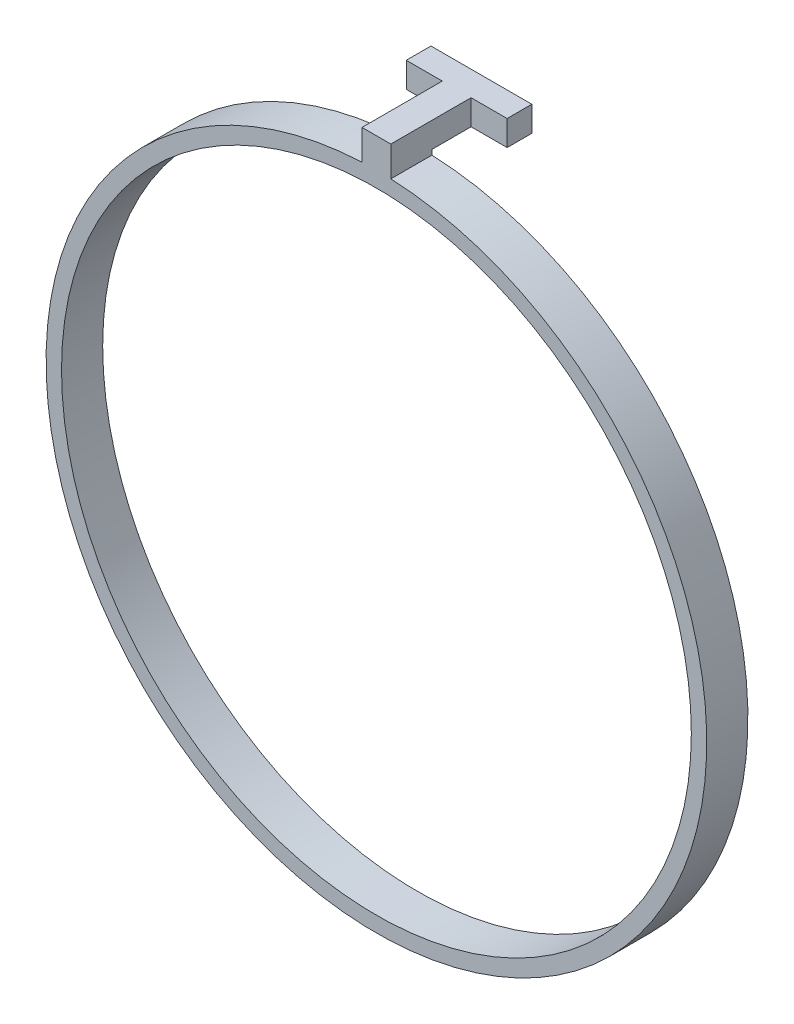
ISO-10303-21;
HEADER;
FILE_DESCRIPTION(('STEP AP214'),'2;1');
FILE_NAME('part.step','',(''),(''),'','','');
FILE_SCHEMA(('AUTOMOTIVE_DESIGN { 1 0 10303 214 1 1 1 1 }'));
ENDSEC;
DATA;
#1=APPLICATION_CONTEXT('core data for automotive mechanical design processes');
#2=APPLICATION_PROTOCOL_DEFINITION('international standard','automotive_design',2000,#1);
#3=PRODUCT_CONTEXT('',#1,'mechanical');
#4=PRODUCT('Part','Part','',(#3));
#5=PRODUCT_RELATED_PRODUCT_CATEGORY('part','',(#4));
#6=PRODUCT_DEFINITION_FORMATION('','',#4);
#7=PRODUCT_DEFINITION_CONTEXT('part definition',#1,'design');
#8=PRODUCT_DEFINITION('design','',#6,#7);
#9=PRODUCT_DEFINITION_SHAPE('','',#8);
#10=(LENGTH_UNIT() NAMED_UNIT(*) SI_UNIT(.MILLI.,.METRE.));
#11=(NAMED_UNIT(*) PLANE_ANGLE_UNIT() SI_UNIT($,.RADIAN.));
#12=(NAMED_UNIT(*) SI_UNIT($,.STERADIAN.) SOLID_ANGLE_UNIT());
#13=UNCERTAINTY_MEASURE_WITH_UNIT(LENGTH_MEASURE(1.E-05),#10,'distance_accuracy_value','');
#14=(GEOMETRIC_REPRESENTATION_CONTEXT(3) GLOBAL_UNCERTAINTY_ASSIGNED_CONTEXT((#13)) GLOBAL_UNIT_ASSIGNED_CONTEXT((#10,
#11,#12)) REPRESENTATION_CONTEXT('',''));
#15=CARTESIAN_POINT('',(0.,0.,0.));
#16=DIRECTION('',(0.,0.,1.));
#17=DIRECTION('',(1.,0.,0.));
#18=AXIS2_PLACEMENT_3D('',#15,#16,#17);
#19=CARTESIAN_POINT('',(0.,0.,0.));
#20=DIRECTION('',(0.,0.,1.));
#21=DIRECTION('',(1.,0.,0.));
#22=AXIS2_PLACEMENT_3D('',#19,#20,#21);
#23=PLANE('',#22);
#24=CARTESIAN_POINT('',(0.,0.,0.));
#25=DIRECTION('',(0.,0.,1.));
#26=DIRECTION('',(1.,0.,0.));
#27=AXIS2_PLACEMENT_3D('',#24,#25,#26);
#28=CIRCLE('',#27,30.6);
#29=CARTESIAN_POINT('',(30.6,0.,0.));
#30=VERTEX_POINT('',#29);
#31=EDGE_CURVE('E163',#30,#30,#28,.T.);
#32=ORIENTED_EDGE('',*,*,#31,.T.);
#33=EDGE_LOOP('',(#32));
#34=FACE_BOUND('',#33,.T.);
#35=DIRECTION('',(-1.,0.,0.));
#36=VECTOR('',#35,1.);
#37=CARTESIAN_POINT('',(1.4,32.55,0.));
#38=LINE('',#37,#36);
#39=CARTESIAN_POINT('',(1.4,32.55,0.));
#40=VERTEX_POINT('',#39);
#41=CARTESIAN_POINT('',(-1.4,32.55,0.));
#42=VERTEX_POINT('',#41);
#43=EDGE_CURVE('E52',#40,#42,#38,.T.);
#44=ORIENTED_EDGE('',*,*,#43,.F.);
#45=DIRECTION('',(0.,1.,0.));
#46=VECTOR('',#45,1.);
#47=CARTESIAN_POINT('',(1.4,35.,0.));
#48=LINE('',#47,#46);
#49=CARTESIAN_POINT('',(1.4,32.0694558731513,0.));
#50=VERTEX_POINT('',#49);
#51=EDGE_CURVE('E172',#50,#40,#48,.T.);
#52=ORIENTED_EDGE('',*,*,#51,.F.);
#53=CARTESIAN_POINT('',(0.,0.,0.));
#54=DIRECTION('',(0.,0.,1.));
#55=DIRECTION('',(1.,0.,0.));
#56=AXIS2_PLACEMENT_3D('',#53,#54,#55);
#57=CIRCLE('',#56,32.1);
#58=CARTESIAN_POINT('',(-1.4,32.0694558731513,0.));
#59=VERTEX_POINT('',#58);
#60=EDGE_CURVE('E76',#59,#50,#57,.T.);
#61=ORIENTED_EDGE('',*,*,#60,.F.);
#62=DIRECTION('',(0.,-1.,0.));
#63=VECTOR('',#62,1.);
#64=CARTESIAN_POINT('',(-1.4,35.,0.));
#65=LINE('',#64,#63);
#66=EDGE_CURVE('E167',#42,#59,#65,.T.);
#67=ORIENTED_EDGE('',*,*,#66,.F.);
#68=EDGE_LOOP('',(#44,#52,#61,#67));
#69=FACE_BOUND('',#68,.T.);
#70=ADVANCED_FACE('F37',(#34,#69),#23,.F.);
#71=CARTESIAN_POINT('',(0.,0.,4.));
#72=DIRECTION('',(0.,0.,1.));
#73=DIRECTION('',(1.,0.,0.));
#74=AXIS2_PLACEMENT_3D('',#71,#72,#73);
#75=PLANE('',#74);
#76=DIRECTION('',(0.,-1.,0.));
#77=VECTOR('',#76,1.);
#78=CARTESIAN_POINT('',(-1.4,35.,4.));
#79=LINE('',#78,#77);
#80=CARTESIAN_POINT('',(-1.4,35.,4.));
#81=VERTEX_POINT('',#80);
#82=CARTESIAN_POINT('',(-1.4,32.0694558731513,4.));
#83=VERTEX_POINT('',#82);
#84=EDGE_CURVE('E170',#81,#83,#79,.T.);
#85=ORIENTED_EDGE('',*,*,#84,.T.);
#86=CARTESIAN_POINT('',(0.,0.,4.));
#87=DIRECTION('',(0.,0.,1.));
#88=DIRECTION('',(1.,0.,0.));
#89=AXIS2_PLACEMENT_3D('',#86,#87,#88);
#90=CIRCLE('',#89,32.1);
#91=CARTESIAN_POINT('',(1.4,32.0694558731513,4.));
#92=VERTEX_POINT('',#91);
#93=EDGE_CURVE('E81',#83,#92,#90,.T.);
#94=ORIENTED_EDGE('',*,*,#93,.T.);
#95=DIRECTION('',(0.,1.,0.));
#96=VECTOR('',#95,1.);
#97=CARTESIAN_POINT('',(1.4,35.,4.));
#98=LINE('',#97,#96);
#99=CARTESIAN_POINT('',(1.4,35.,4.));
#100=VERTEX_POINT('',#99);
#101=EDGE_CURVE('E174',#92,#100,#98,.T.);
#102=ORIENTED_EDGE('',*,*,#101,.T.);
#103=DIRECTION('',(-1.,0.,0.));
#104=VECTOR('',#103,1.);
#105=CARTESIAN_POINT('',(-1.4,35.,4.));
#106=LINE('',#105,#104);
#107=EDGE_CURVE('E61',#100,#81,#106,.T.);
#108=ORIENTED_EDGE('',*,*,#107,.T.);
#109=EDGE_LOOP('',(#85,#94,#102,#108));
#110=FACE_BOUND('',#109,.T.);
#111=CARTESIAN_POINT('',(0.,0.,4.));
#112=DIRECTION('',(0.,0.,1.));
#113=DIRECTION('',(1.,0.,0.));
#114=AXIS2_PLACEMENT_3D('',#111,#112,#113);
#115=CIRCLE('',#114,30.6);
#116=CARTESIAN_POINT('',(30.6,0.,4.));
#117=VERTEX_POINT('',#116);
#118=EDGE_CURVE('E164',#117,#117,#115,.T.);
#119=ORIENTED_EDGE('',*,*,#118,.F.);
#120=EDGE_LOOP('',(#119));
#121=FACE_BOUND('',#120,.T.);
#122=ADVANCED_FACE('F229',(#110,#121),#75,.T.);
#123=CARTESIAN_POINT('',(-1.4,35.,4.));
#124=DIRECTION('',(1.,0.,0.));
#125=DIRECTION('',(0.,0.,-1.));
#126=AXIS2_PLACEMENT_3D('',#123,#124,#125);
#127=PLANE('',#126);
#128=DIRECTION('',(0.,0.,-1.));
#129=VECTOR('',#128,1.);
#130=CARTESIAN_POINT('',(-1.4,35.,4.));
#131=LINE('',#130,#129);
#132=CARTESIAN_POINT('',(-1.4,35.,-3.8));
#133=VERTEX_POINT('',#132);
#134=EDGE_CURVE('E177',#81,#133,#131,.T.);
#135=ORIENTED_EDGE('',*,*,#134,.T.);
#136=DIRECTION('',(0.,1.,0.));
#137=VECTOR('',#136,1.);
#138=CARTESIAN_POINT('',(-1.4,35.,-3.8));
#139=LINE('',#138,#137);
#140=CARTESIAN_POINT('',(-1.4,32.55,-3.8));
#141=VERTEX_POINT('',#140);
#142=EDGE_CURVE('E155',#141,#133,#139,.T.);
#143=ORIENTED_EDGE('',*,*,#142,.F.);
#144=DIRECTION('',(0.,0.,1.));
#145=VECTOR('',#144,1.);
#146=CARTESIAN_POINT('',(-1.4,32.55,-3.8));
#147=LINE('',#146,#145);
#148=EDGE_CURVE('E157',#141,#42,#147,.T.);
#149=ORIENTED_EDGE('',*,*,#148,.T.);
#150=ORIENTED_EDGE('',*,*,#66,.T.);
#151=DIRECTION('',(0.,0.,-1.));
#152=VECTOR('',#151,1.);
#153=CARTESIAN_POINT('',(-1.4,32.0694558731513,4.));
#154=LINE('',#153,#152);
#155=EDGE_CURVE('E11',#83,#59,#154,.T.);
#156=ORIENTED_EDGE('',*,*,#155,.F.);
#157=ORIENTED_EDGE('',*,*,#84,.F.);
#158=EDGE_LOOP('',(#135,#143,#149,#150,#156,#157));
#159=FACE_BOUND('',#158,.T.);
#160=ADVANCED_FACE('F39',(#159),#127,.F.);
#161=CARTESIAN_POINT('',(0.,0.,4.));
#162=DIRECTION('',(0.,0.,-1.));
#163=DIRECTION('',(-1.,0.,0.));
#164=AXIS2_PLACEMENT_3D('',#161,#162,#163);
#165=CYLINDRICAL_SURFACE('',#164,32.1);
#166=ORIENTED_EDGE('',*,*,#60,.T.);
#167=DIRECTION('',(0.,0.,-1.));
#168=VECTOR('',#167,1.);
#169=CARTESIAN_POINT('',(1.4,32.0694558731513,4.));
#170=LINE('',#169,#168);
#171=EDGE_CURVE('E45',#92,#50,#170,.T.);
#172=ORIENTED_EDGE('',*,*,#171,.F.);
#173=ORIENTED_EDGE('',*,*,#93,.F.);
#174=ORIENTED_EDGE('',*,*,#155,.T.);
#175=EDGE_LOOP('',(#166,#172,#173,#174));
#176=FACE_BOUND('',#175,.T.);
#177=ADVANCED_FACE('F188',(#176),#165,.T.);
#178=CARTESIAN_POINT('',(1.4,35.,4.));
#179=DIRECTION('',(-1.,0.,0.));
#180=DIRECTION('',(0.,0.,1.));
#181=AXIS2_PLACEMENT_3D('',#178,#179,#180);
#182=PLANE('',#181);
#183=ORIENTED_EDGE('',*,*,#51,.T.);
#184=DIRECTION('',(0.,0.,1.));
#185=VECTOR('',#184,1.);
#186=CARTESIAN_POINT('',(1.4,32.55,-3.8));
#187=LINE('',#186,#185);
#188=CARTESIAN_POINT('',(1.4,32.55,-3.8));
#189=VERTEX_POINT('',#188);
#190=EDGE_CURVE('E161',#189,#40,#187,.T.);
#191=ORIENTED_EDGE('',*,*,#190,.F.);
#192=DIRECTION('',(0.,-1.,0.));
#193=VECTOR('',#192,1.);
#194=CARTESIAN_POINT('',(1.4,35.,-3.8));
#195=LINE('',#194,#193);
#196=CARTESIAN_POINT('',(1.4,35.,-3.8));
#197=VERTEX_POINT('',#196);
#198=EDGE_CURVE('E147',#197,#189,#195,.T.);
#199=ORIENTED_EDGE('',*,*,#198,.F.);
#200=DIRECTION('',(0.,0.,-1.));
#201=VECTOR('',#200,1.);
#202=CARTESIAN_POINT('',(1.4,35.,4.));
#203=LINE('',#202,#201);
#204=EDGE_CURVE('E182',#100,#197,#203,.T.);
#205=ORIENTED_EDGE('',*,*,#204,.F.);
#206=ORIENTED_EDGE('',*,*,#101,.F.);
#207=ORIENTED_EDGE('',*,*,#171,.T.);
#208=EDGE_LOOP('',(#183,#191,#199,#205,#206,#207));
#209=FACE_BOUND('',#208,.T.);
#210=ADVANCED_FACE('F185',(#209),#182,.F.);
#211=CARTESIAN_POINT('',(-1.4,35.,4.));
#212=DIRECTION('',(0.,-1.,0.));
#213=DIRECTION('',(0.,0.,-1.));
#214=AXIS2_PLACEMENT_3D('',#211,#212,#213);
#215=PLANE('',#214);
#216=ORIENTED_EDGE('',*,*,#204,.T.);
#217=DIRECTION('',(-1.,0.,0.));
#218=VECTOR('',#217,1.);
#219=CARTESIAN_POINT('',(4.9,35.,-3.8));
#220=LINE('',#219,#218);
#221=CARTESIAN_POINT('',(4.9,35.,-3.8));
#222=VERTEX_POINT('',#221);
#223=EDGE_CURVE('E194',#222,#197,#220,.T.);
#224=ORIENTED_EDGE('',*,*,#223,.F.);
#225=DIRECTION('',(0.,0.,1.));
#226=VECTOR('',#225,1.);
#227=CARTESIAN_POINT('',(4.9,35.,-3.8));
#228=LINE('',#227,#226);
#229=CARTESIAN_POINT('',(4.9,35.,-6.2));
#230=VERTEX_POINT('',#229);
#231=EDGE_CURVE('E138',#230,#222,#228,.T.);
#232=ORIENTED_EDGE('',*,*,#231,.F.);
#233=DIRECTION('',(-1.,0.,0.));
#234=VECTOR('',#233,1.);
#235=CARTESIAN_POINT('',(4.9,35.,-6.2));
#236=LINE('',#235,#234);
#237=CARTESIAN_POINT('',(-4.9,35.,-6.2));
#238=VERTEX_POINT('',#237);
#239=EDGE_CURVE('E196',#230,#238,#236,.T.);
#240=ORIENTED_EDGE('',*,*,#239,.T.);
#241=DIRECTION('',(0.,0.,1.));
#242=VECTOR('',#241,1.);
#243=CARTESIAN_POINT('',(-4.9,35.,-3.8));
#244=LINE('',#243,#242);
#245=CARTESIAN_POINT('',(-4.9,35.,-3.8));
#246=VERTEX_POINT('',#245);
#247=EDGE_CURVE('E142',#238,#246,#244,.T.);
#248=ORIENTED_EDGE('',*,*,#247,.T.);
#249=EDGE_CURVE('E197',#133,#246,#220,.T.);
#250=ORIENTED_EDGE('',*,*,#249,.F.);
#251=ORIENTED_EDGE('',*,*,#134,.F.);
#252=ORIENTED_EDGE('',*,*,#107,.F.);
#253=EDGE_LOOP('',(#216,#224,#232,#240,#248,#250,#251,#252));
#254=FACE_BOUND('',#253,.T.);
#255=ADVANCED_FACE('F216',(#254),#215,.F.);
#256=CARTESIAN_POINT('',(0.,0.,4.));
#257=DIRECTION('',(0.,0.,-1.));
#258=DIRECTION('',(-1.,0.,0.));
#259=AXIS2_PLACEMENT_3D('',#256,#257,#258);
#260=CYLINDRICAL_SURFACE('',#259,30.6);
#261=ORIENTED_EDGE('',*,*,#118,.T.);
#262=EDGE_LOOP('',(#261));
#263=FACE_BOUND('',#262,.T.);
#264=ORIENTED_EDGE('',*,*,#31,.F.);
#265=EDGE_LOOP('',(#264));
#266=FACE_BOUND('',#265,.T.);
#267=ADVANCED_FACE('F218',(#263,#266),#260,.F.);
#268=CARTESIAN_POINT('',(1.4,32.55,-3.8));
#269=DIRECTION('',(0.,1.,0.));
#270=DIRECTION('',(0.,0.,1.));
#271=AXIS2_PLACEMENT_3D('',#268,#269,#270);
#272=PLANE('',#271);
#273=ORIENTED_EDGE('',*,*,#43,.T.);
#274=ORIENTED_EDGE('',*,*,#148,.F.);
#275=DIRECTION('',(-1.,0.,0.));
#276=VECTOR('',#275,1.);
#277=CARTESIAN_POINT('',(4.9,32.55,-3.8));
#278=LINE('',#277,#276);
#279=CARTESIAN_POINT('',(-4.9,32.55,-3.8));
#280=VERTEX_POINT('',#279);
#281=EDGE_CURVE('E148',#141,#280,#278,.T.);
#282=ORIENTED_EDGE('',*,*,#281,.T.);
#283=DIRECTION('',(0.,0.,-1.));
#284=VECTOR('',#283,1.);
#285=CARTESIAN_POINT('',(-4.9,32.55,-3.8));
#286=LINE('',#285,#284);
#287=CARTESIAN_POINT('',(-4.9,32.55,-6.2));
#288=VERTEX_POINT('',#287);
#289=EDGE_CURVE('E205',#280,#288,#286,.T.);
#290=ORIENTED_EDGE('',*,*,#289,.T.);
#291=DIRECTION('',(-1.,0.,0.));
#292=VECTOR('',#291,1.);
#293=CARTESIAN_POINT('',(4.9,32.55,-6.2));
#294=LINE('',#293,#292);
#295=CARTESIAN_POINT('',(4.9,32.55,-6.2));
#296=VERTEX_POINT('',#295);
#297=EDGE_CURVE('E129',#296,#288,#294,.T.);
#298=ORIENTED_EDGE('',*,*,#297,.F.);
#299=DIRECTION('',(0.,0.,-1.));
#300=VECTOR('',#299,1.);
#301=CARTESIAN_POINT('',(4.9,32.55,-3.8));
#302=LINE('',#301,#300);
#303=CARTESIAN_POINT('',(4.9,32.55,-3.8));
#304=VERTEX_POINT('',#303);
#305=EDGE_CURVE('E122',#304,#296,#302,.T.);
#306=ORIENTED_EDGE('',*,*,#305,.F.);
#307=EDGE_CURVE('E127',#304,#189,#278,.T.);
#308=ORIENTED_EDGE('',*,*,#307,.T.);
#309=ORIENTED_EDGE('',*,*,#190,.T.);
#310=EDGE_LOOP('',(#273,#274,#282,#290,#298,#306,#308,#309));
#311=FACE_BOUND('',#310,.T.);
#312=ADVANCED_FACE('F124',(#311),#272,.F.);
#313=CARTESIAN_POINT('',(4.9,35.,-3.8));
#314=DIRECTION('',(0.,0.,-1.));
#315=DIRECTION('',(0.,1.,0.));
#316=AXIS2_PLACEMENT_3D('',#313,#314,#315);
#317=PLANE('',#316);
#318=ORIENTED_EDGE('',*,*,#223,.T.);
#319=ORIENTED_EDGE('',*,*,#198,.T.);
#320=ORIENTED_EDGE('',*,*,#307,.F.);
#321=DIRECTION('',(0.,-1.,0.));
#322=VECTOR('',#321,1.);
#323=CARTESIAN_POINT('',(4.9,35.,-3.8));
#324=LINE('',#323,#322);
#325=EDGE_CURVE('E133',#222,#304,#324,.T.);
#326=ORIENTED_EDGE('',*,*,#325,.F.);
#327=EDGE_LOOP('',(#318,#319,#320,#326));
#328=FACE_BOUND('',#327,.T.);
#329=ADVANCED_FACE('F145',(#328),#317,.F.);
#330=ORIENTED_EDGE('',*,*,#281,.F.);
#331=ORIENTED_EDGE('',*,*,#142,.T.);
#332=ORIENTED_EDGE('',*,*,#249,.T.);
#333=DIRECTION('',(0.,-1.,0.));
#334=VECTOR('',#333,1.);
#335=CARTESIAN_POINT('',(-4.9,35.,-3.8));
#336=LINE('',#335,#334);
#337=EDGE_CURVE('E207',#246,#280,#336,.T.);
#338=ORIENTED_EDGE('',*,*,#337,.T.);
#339=EDGE_LOOP('',(#330,#331,#332,#338));
#340=FACE_BOUND('',#339,.T.);
#341=ADVANCED_FACE('F240',(#340),#317,.F.);
#342=CARTESIAN_POINT('',(4.9,35.,-6.2));
#343=DIRECTION('',(0.,0.,1.));
#344=DIRECTION('',(0.,-1.,0.));
#345=AXIS2_PLACEMENT_3D('',#342,#343,#344);
#346=PLANE('',#345);
#347=DIRECTION('',(0.,1.,0.));
#348=VECTOR('',#347,1.);
#349=CARTESIAN_POINT('',(-4.9,35.,-6.2));
#350=LINE('',#349,#348);
#351=EDGE_CURVE('E203',#288,#238,#350,.T.);
#352=ORIENTED_EDGE('',*,*,#351,.T.);
#353=ORIENTED_EDGE('',*,*,#239,.F.);
#354=DIRECTION('',(0.,1.,0.));
#355=VECTOR('',#354,1.);
#356=CARTESIAN_POINT('',(4.9,35.,-6.2));
#357=LINE('',#356,#355);
#358=EDGE_CURVE('E132',#296,#230,#357,.T.);
#359=ORIENTED_EDGE('',*,*,#358,.F.);
#360=ORIENTED_EDGE('',*,*,#297,.T.);
#361=EDGE_LOOP('',(#352,#353,#359,#360));
#362=FACE_BOUND('',#361,.T.);
#363=ADVANCED_FACE('F213',(#362),#346,.F.);
#364=CARTESIAN_POINT('',(4.9,0.,0.));
#365=DIRECTION('',(1.,0.,0.));
#366=DIRECTION('',(0.,0.,-1.));
#367=AXIS2_PLACEMENT_3D('',#364,#365,#366);
#368=PLANE('',#367);
#369=ORIENTED_EDGE('',*,*,#325,.T.);
#370=ORIENTED_EDGE('',*,*,#305,.T.);
#371=ORIENTED_EDGE('',*,*,#358,.T.);
#372=ORIENTED_EDGE('',*,*,#231,.T.);
#373=EDGE_LOOP('',(#369,#370,#371,#372));
#374=FACE_BOUND('',#373,.T.);
#375=ADVANCED_FACE('F136',(#374),#368,.T.);
#376=CARTESIAN_POINT('',(-4.9,0.,0.));
#377=DIRECTION('',(1.,0.,0.));
#378=DIRECTION('',(0.,0.,-1.));
#379=AXIS2_PLACEMENT_3D('',#376,#377,#378);
#380=PLANE('',#379);
#381=ORIENTED_EDGE('',*,*,#337,.F.);
#382=ORIENTED_EDGE('',*,*,#247,.F.);
#383=ORIENTED_EDGE('',*,*,#351,.F.);
#384=ORIENTED_EDGE('',*,*,#289,.F.);
#385=EDGE_LOOP('',(#381,#382,#383,#384));
#386=FACE_BOUND('',#385,.T.);
#387=ADVANCED_FACE('F243',(#386),#380,.F.);
#388=CLOSED_SHELL('',(#70,#122,#160,#177,#210,#255,#267,#312,#329,#341,#363,#375,#387));
#389=MANIFOLD_SOLID_BREP('B2',#388);
#390=ADVANCED_BREP_SHAPE_REPRESENTATION('',(#18,#389),#14);
#391=SHAPE_DEFINITION_REPRESENTATION(#9,#390);
ENDSEC;
END-ISO-10303-21;
